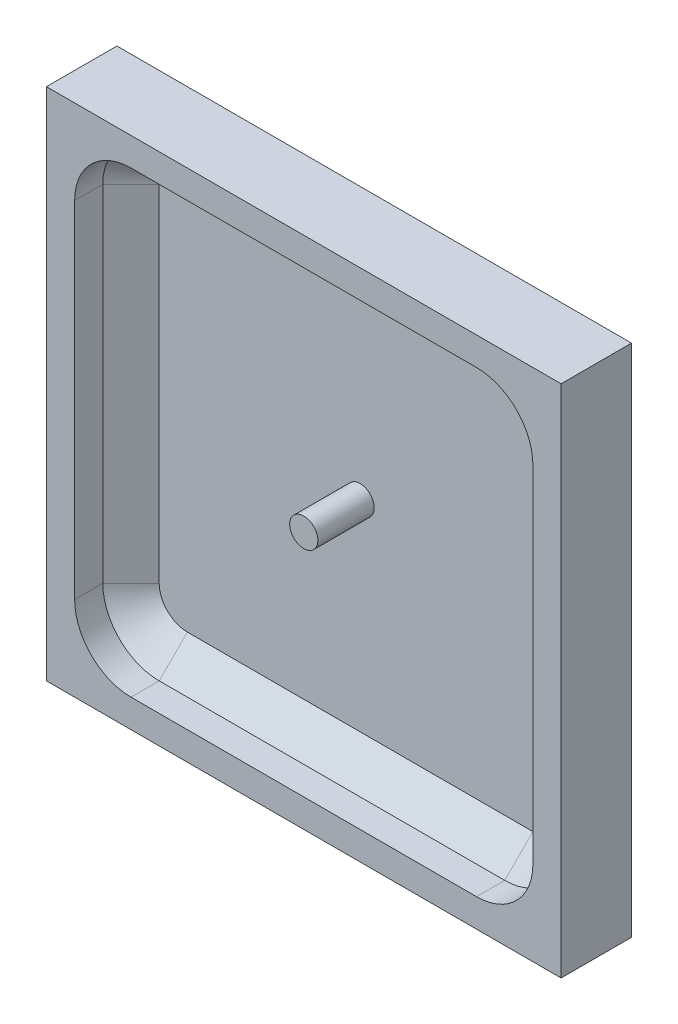
ISO-10303-21;
HEADER;
FILE_DESCRIPTION(('STEP AP214'),'2;1');
FILE_NAME('part.step','',(''),(''),'','','');
FILE_SCHEMA(('AUTOMOTIVE_DESIGN { 1 0 10303 214 1 1 1 1 }'));
ENDSEC;
DATA;
#1=APPLICATION_CONTEXT('core data for automotive mechanical design processes');
#2=APPLICATION_PROTOCOL_DEFINITION('international standard','automotive_design',2000,#1);
#3=PRODUCT_CONTEXT('',#1,'mechanical');
#4=PRODUCT('Part','Part','',(#3));
#5=PRODUCT_RELATED_PRODUCT_CATEGORY('part','',(#4));
#6=PRODUCT_DEFINITION_FORMATION('','',#4);
#7=PRODUCT_DEFINITION_CONTEXT('part definition',#1,'design');
#8=PRODUCT_DEFINITION('design','',#6,#7);
#9=PRODUCT_DEFINITION_SHAPE('','',#8);
#10=(LENGTH_UNIT() NAMED_UNIT(*) SI_UNIT(.MILLI.,.METRE.));
#11=(NAMED_UNIT(*) PLANE_ANGLE_UNIT() SI_UNIT($,.RADIAN.));
#12=(NAMED_UNIT(*) SI_UNIT($,.STERADIAN.) SOLID_ANGLE_UNIT());
#13=UNCERTAINTY_MEASURE_WITH_UNIT(LENGTH_MEASURE(1.E-05),#10,'distance_accuracy_value','');
#14=(GEOMETRIC_REPRESENTATION_CONTEXT(3) GLOBAL_UNCERTAINTY_ASSIGNED_CONTEXT((#13)) GLOBAL_UNIT_ASSIGNED_CONTEXT((#10,
#11,#12)) REPRESENTATION_CONTEXT('',''));
#15=CARTESIAN_POINT('',(0.,0.,0.));
#16=DIRECTION('',(0.,0.,1.));
#17=DIRECTION('',(1.,0.,0.));
#18=AXIS2_PLACEMENT_3D('',#15,#16,#17);
#19=CARTESIAN_POINT('',(-18.2634559672906,-18.2634559672906,-5.));
#20=DIRECTION('',(-1.,0.,0.));
#21=DIRECTION('',(0.,0.,1.));
#22=AXIS2_PLACEMENT_3D('',#19,#20,#21);
#23=PLANE('',#22);
#24=DIRECTION('',(0.,-1.,0.));
#25=VECTOR('',#24,1.);
#26=CARTESIAN_POINT('',(-18.2634559672906,-18.2634559672906,0.));
#27=LINE('',#26,#25);
#28=CARTESIAN_POINT('',(-18.2634559672906,18.2634559672906,0.));
#29=VERTEX_POINT('',#28);
#30=CARTESIAN_POINT('',(-18.2634559672906,-18.2634559672906,0.));
#31=VERTEX_POINT('',#30);
#32=EDGE_CURVE('E238',#29,#31,#27,.T.);
#33=ORIENTED_EDGE('',*,*,#32,.F.);
#34=DIRECTION('',(0.,0.,1.));
#35=VECTOR('',#34,1.);
#36=CARTESIAN_POINT('',(-18.2634559672906,18.2634559672906,-5.));
#37=LINE('',#36,#35);
#38=CARTESIAN_POINT('',(-18.2634559672906,18.2634559672906,-5.));
#39=VERTEX_POINT('',#38);
#40=EDGE_CURVE('E11',#39,#29,#37,.T.);
#41=ORIENTED_EDGE('',*,*,#40,.F.);
#42=DIRECTION('',(0.,-1.,0.));
#43=VECTOR('',#42,1.);
#44=CARTESIAN_POINT('',(-18.2634559672906,-18.2634559672906,-5.));
#45=LINE('',#44,#43);
#46=CARTESIAN_POINT('',(-18.2634559672906,-18.2634559672906,-5.));
#47=VERTEX_POINT('',#46);
#48=EDGE_CURVE('E262',#39,#47,#45,.T.);
#49=ORIENTED_EDGE('',*,*,#48,.T.);
#50=DIRECTION('',(0.,0.,1.));
#51=VECTOR('',#50,1.);
#52=CARTESIAN_POINT('',(-18.2634559672906,-18.2634559672906,-5.));
#53=LINE('',#52,#51);
#54=EDGE_CURVE('E42',#47,#31,#53,.T.);
#55=ORIENTED_EDGE('',*,*,#54,.T.);
#56=EDGE_LOOP('',(#33,#41,#49,#55));
#57=FACE_BOUND('',#56,.T.);
#58=ADVANCED_FACE('F39',(#57),#23,.T.);
#59=CARTESIAN_POINT('',(18.2634559672906,18.2634559672906,-5.));
#60=DIRECTION('',(0.,1.,0.));
#61=DIRECTION('',(0.,0.,1.));
#62=AXIS2_PLACEMENT_3D('',#59,#60,#61);
#63=PLANE('',#62);
#64=DIRECTION('',(-1.,0.,0.));
#65=VECTOR('',#64,1.);
#66=CARTESIAN_POINT('',(18.2634559672906,18.2634559672906,0.));
#67=LINE('',#66,#65);
#68=CARTESIAN_POINT('',(18.2634559672906,18.2634559672906,0.));
#69=VERTEX_POINT('',#68);
#70=EDGE_CURVE('E265',#69,#29,#67,.T.);
#71=ORIENTED_EDGE('',*,*,#70,.F.);
#72=DIRECTION('',(0.,0.,1.));
#73=VECTOR('',#72,1.);
#74=CARTESIAN_POINT('',(18.2634559672906,18.2634559672906,-5.));
#75=LINE('',#74,#73);
#76=CARTESIAN_POINT('',(18.2634559672906,18.2634559672906,-5.));
#77=VERTEX_POINT('',#76);
#78=EDGE_CURVE('E47',#77,#69,#75,.T.);
#79=ORIENTED_EDGE('',*,*,#78,.F.);
#80=DIRECTION('',(-1.,0.,0.));
#81=VECTOR('',#80,1.);
#82=CARTESIAN_POINT('',(18.2634559672906,18.2634559672906,-5.));
#83=LINE('',#82,#81);
#84=EDGE_CURVE('E270',#77,#39,#83,.T.);
#85=ORIENTED_EDGE('',*,*,#84,.T.);
#86=ORIENTED_EDGE('',*,*,#40,.T.);
#87=EDGE_LOOP('',(#71,#79,#85,#86));
#88=FACE_BOUND('',#87,.T.);
#89=ADVANCED_FACE('F285',(#88),#63,.T.);
#90=CARTESIAN_POINT('',(18.2634559672906,-18.2634559672906,-5.));
#91=DIRECTION('',(1.,0.,0.));
#92=DIRECTION('',(0.,0.,-1.));
#93=AXIS2_PLACEMENT_3D('',#90,#91,#92);
#94=PLANE('',#93);
#95=DIRECTION('',(0.,1.,0.));
#96=VECTOR('',#95,1.);
#97=CARTESIAN_POINT('',(18.2634559672906,-18.2634559672906,0.));
#98=LINE('',#97,#96);
#99=CARTESIAN_POINT('',(18.2634559672906,-18.2634559672906,0.));
#100=VERTEX_POINT('',#99);
#101=EDGE_CURVE('E277',#100,#69,#98,.T.);
#102=ORIENTED_EDGE('',*,*,#101,.F.);
#103=DIRECTION('',(0.,0.,1.));
#104=VECTOR('',#103,1.);
#105=CARTESIAN_POINT('',(18.2634559672906,-18.2634559672906,-5.));
#106=LINE('',#105,#104);
#107=CARTESIAN_POINT('',(18.2634559672906,-18.2634559672906,-5.));
#108=VERTEX_POINT('',#107);
#109=EDGE_CURVE('E282',#108,#100,#106,.T.);
#110=ORIENTED_EDGE('',*,*,#109,.F.);
#111=DIRECTION('',(0.,1.,0.));
#112=VECTOR('',#111,1.);
#113=CARTESIAN_POINT('',(18.2634559672906,-18.2634559672906,-5.));
#114=LINE('',#113,#112);
#115=EDGE_CURVE('E267',#108,#77,#114,.T.);
#116=ORIENTED_EDGE('',*,*,#115,.T.);
#117=ORIENTED_EDGE('',*,*,#78,.T.);
#118=EDGE_LOOP('',(#102,#110,#116,#117));
#119=FACE_BOUND('',#118,.T.);
#120=ADVANCED_FACE('F289',(#119),#94,.T.);
#121=CARTESIAN_POINT('',(18.2634559672906,-18.2634559672906,-5.));
#122=DIRECTION('',(0.,-1.,0.));
#123=DIRECTION('',(0.,0.,-1.));
#124=AXIS2_PLACEMENT_3D('',#121,#122,#123);
#125=PLANE('',#124);
#126=DIRECTION('',(1.,0.,0.));
#127=VECTOR('',#126,1.);
#128=CARTESIAN_POINT('',(18.2634559672906,-18.2634559672906,0.));
#129=LINE('',#128,#127);
#130=EDGE_CURVE('E274',#31,#100,#129,.T.);
#131=ORIENTED_EDGE('',*,*,#130,.F.);
#132=ORIENTED_EDGE('',*,*,#54,.F.);
#133=DIRECTION('',(1.,0.,0.));
#134=VECTOR('',#133,1.);
#135=CARTESIAN_POINT('',(18.2634559672906,-18.2634559672906,-5.));
#136=LINE('',#135,#134);
#137=EDGE_CURVE('E264',#47,#108,#136,.T.);
#138=ORIENTED_EDGE('',*,*,#137,.T.);
#139=ORIENTED_EDGE('',*,*,#109,.T.);
#140=EDGE_LOOP('',(#131,#132,#138,#139));
#141=FACE_BOUND('',#140,.T.);
#142=ADVANCED_FACE('F284',(#141),#125,.T.);
#143=CARTESIAN_POINT('',(0.,0.,-5.));
#144=DIRECTION('',(0.,0.,1.));
#145=DIRECTION('',(1.,0.,0.));
#146=AXIS2_PLACEMENT_3D('',#143,#144,#145);
#147=PLANE('',#146);
#148=ORIENTED_EDGE('',*,*,#48,.F.);
#149=ORIENTED_EDGE('',*,*,#84,.F.);
#150=ORIENTED_EDGE('',*,*,#115,.F.);
#151=ORIENTED_EDGE('',*,*,#137,.F.);
#152=EDGE_LOOP('',(#148,#149,#150,#151));
#153=FACE_BOUND('',#152,.T.);
#154=ADVANCED_FACE('F291',(#153),#147,.F.);
#155=CARTESIAN_POINT('',(0.,0.,0.));
#156=DIRECTION('',(0.,0.,1.));
#157=DIRECTION('',(1.,0.,0.));
#158=AXIS2_PLACEMENT_3D('',#155,#156,#157);
#159=PLANE('',#158);
#160=CARTESIAN_POINT('',(-12.2634559672906,-12.2634559672906,0.));
#161=DIRECTION('',(0.,0.,-1.));
#162=DIRECTION('',(-1.,0.,0.));
#163=AXIS2_PLACEMENT_3D('',#160,#161,#162);
#164=CIRCLE('',#163,4.);
#165=CARTESIAN_POINT('',(-16.2634559672906,-12.2634559672906,0.));
#166=VERTEX_POINT('',#165);
#167=CARTESIAN_POINT('',(-12.2634559672906,-16.2634559672906,0.));
#168=VERTEX_POINT('',#167);
#169=EDGE_CURVE('E187',#166,#168,#164,.F.);
#170=ORIENTED_EDGE('',*,*,#169,.F.);
#171=DIRECTION('',(0.,1.,0.));
#172=VECTOR('',#171,1.);
#173=CARTESIAN_POINT('',(-16.2634559672906,-16.2634559672906,0.));
#174=LINE('',#173,#172);
#175=CARTESIAN_POINT('',(-16.2634559672906,12.2634559672906,0.));
#176=VERTEX_POINT('',#175);
#177=EDGE_CURVE('E181',#166,#176,#174,.T.);
#178=ORIENTED_EDGE('',*,*,#177,.T.);
#179=CARTESIAN_POINT('',(-12.2634559672906,12.2634559672906,0.));
#180=DIRECTION('',(0.,0.,-1.));
#181=DIRECTION('',(-1.,0.,0.));
#182=AXIS2_PLACEMENT_3D('',#179,#180,#181);
#183=CIRCLE('',#182,4.);
#184=CARTESIAN_POINT('',(-12.2634559672906,16.2634559672906,0.));
#185=VERTEX_POINT('',#184);
#186=EDGE_CURVE('E191',#185,#176,#183,.F.);
#187=ORIENTED_EDGE('',*,*,#186,.F.);
#188=DIRECTION('',(1.,0.,0.));
#189=VECTOR('',#188,1.);
#190=CARTESIAN_POINT('',(-16.2634559672906,16.2634559672906,0.));
#191=LINE('',#190,#189);
#192=CARTESIAN_POINT('',(12.2634559672906,16.2634559672906,0.));
#193=VERTEX_POINT('',#192);
#194=EDGE_CURVE('E522',#185,#193,#191,.T.);
#195=ORIENTED_EDGE('',*,*,#194,.T.);
#196=CARTESIAN_POINT('',(12.2634559672906,12.2634559672906,0.));
#197=DIRECTION('',(0.,0.,-1.));
#198=DIRECTION('',(-1.,0.,0.));
#199=AXIS2_PLACEMENT_3D('',#196,#197,#198);
#200=CIRCLE('',#199,4.);
#201=CARTESIAN_POINT('',(16.2634559672906,12.2634559672906,0.));
#202=VERTEX_POINT('',#201);
#203=EDGE_CURVE('E171',#202,#193,#200,.F.);
#204=ORIENTED_EDGE('',*,*,#203,.F.);
#205=DIRECTION('',(0.,-1.,0.));
#206=VECTOR('',#205,1.);
#207=CARTESIAN_POINT('',(16.2634559672906,-16.2634559672906,0.));
#208=LINE('',#207,#206);
#209=CARTESIAN_POINT('',(16.2634559672906,-12.2634559672906,0.));
#210=VERTEX_POINT('',#209);
#211=EDGE_CURVE('E55',#202,#210,#208,.T.);
#212=ORIENTED_EDGE('',*,*,#211,.T.);
#213=CARTESIAN_POINT('',(12.2634559672906,-12.2634559672906,0.));
#214=DIRECTION('',(0.,0.,-1.));
#215=DIRECTION('',(-1.,0.,0.));
#216=AXIS2_PLACEMENT_3D('',#213,#214,#215);
#217=CIRCLE('',#216,4.);
#218=CARTESIAN_POINT('',(12.2634559672906,-16.2634559672906,0.));
#219=VERTEX_POINT('',#218);
#220=EDGE_CURVE('E166',#219,#210,#217,.F.);
#221=ORIENTED_EDGE('',*,*,#220,.F.);
#222=DIRECTION('',(-1.,0.,0.));
#223=VECTOR('',#222,1.);
#224=CARTESIAN_POINT('',(-16.2634559672906,-16.2634559672906,0.));
#225=LINE('',#224,#223);
#226=EDGE_CURVE('E176',#219,#168,#225,.T.);
#227=ORIENTED_EDGE('',*,*,#226,.T.);
#228=EDGE_LOOP('',(#170,#178,#187,#195,#204,#212,#221,#227));
#229=FACE_BOUND('',#228,.T.);
#230=ORIENTED_EDGE('',*,*,#32,.T.);
#231=ORIENTED_EDGE('',*,*,#130,.T.);
#232=ORIENTED_EDGE('',*,*,#101,.T.);
#233=ORIENTED_EDGE('',*,*,#70,.T.);
#234=EDGE_LOOP('',(#230,#231,#232,#233));
#235=FACE_BOUND('',#234,.T.);
#236=ADVANCED_FACE('F183',(#229,#235),#159,.T.);
#237=CARTESIAN_POINT('',(16.2634559672906,-16.2634559672906,-4.));
#238=DIRECTION('',(-1.,0.,0.));
#239=DIRECTION('',(0.,0.,1.));
#240=AXIS2_PLACEMENT_3D('',#237,#238,#239);
#241=PLANE('',#240);
#242=DIRECTION('',(0.,0.,1.));
#243=VECTOR('',#242,1.);
#244=CARTESIAN_POINT('',(16.2634559672906,-12.2634559672906,-4.));
#245=LINE('',#244,#243);
#246=CARTESIAN_POINT('',(16.2634559672906,-12.2634559672906,-2.));
#247=VERTEX_POINT('',#246);
#248=EDGE_CURVE('E189',#210,#247,#245,.F.);
#249=ORIENTED_EDGE('',*,*,#248,.F.);
#250=ORIENTED_EDGE('',*,*,#211,.F.);
#251=DIRECTION('',(0.,0.,1.));
#252=VECTOR('',#251,1.);
#253=CARTESIAN_POINT('',(16.2634559672906,12.2634559672906,-4.));
#254=LINE('',#253,#252);
#255=CARTESIAN_POINT('',(16.2634559672906,12.2634559672906,-2.));
#256=VERTEX_POINT('',#255);
#257=EDGE_CURVE('E186',#256,#202,#254,.T.);
#258=ORIENTED_EDGE('',*,*,#257,.F.);
#259=DIRECTION('',(0.,1.,0.));
#260=VECTOR('',#259,1.);
#261=CARTESIAN_POINT('',(16.2634559672906,12.2634559672906,-2.));
#262=LINE('',#261,#260);
#263=EDGE_CURVE('E230',#247,#256,#262,.T.);
#264=ORIENTED_EDGE('',*,*,#263,.F.);
#265=EDGE_LOOP('',(#249,#250,#258,#264));
#266=FACE_BOUND('',#265,.T.);
#267=ADVANCED_FACE('F298',(#266),#241,.T.);
#268=CARTESIAN_POINT('',(-16.2634559672906,-16.2634559672906,-4.));
#269=DIRECTION('',(0.,1.,0.));
#270=DIRECTION('',(1.,0.,0.));
#271=AXIS2_PLACEMENT_3D('',#268,#269,#270);
#272=PLANE('',#271);
#273=DIRECTION('',(0.,0.,1.));
#274=VECTOR('',#273,1.);
#275=CARTESIAN_POINT('',(-12.2634559672906,-16.2634559672906,-4.));
#276=LINE('',#275,#274);
#277=CARTESIAN_POINT('',(-12.2634559672906,-16.2634559672906,-2.));
#278=VERTEX_POINT('',#277);
#279=EDGE_CURVE('E172',#168,#278,#276,.F.);
#280=ORIENTED_EDGE('',*,*,#279,.F.);
#281=ORIENTED_EDGE('',*,*,#226,.F.);
#282=DIRECTION('',(0.,0.,1.));
#283=VECTOR('',#282,1.);
#284=CARTESIAN_POINT('',(12.2634559672906,-16.2634559672906,-4.));
#285=LINE('',#284,#283);
#286=CARTESIAN_POINT('',(12.2634559672906,-16.2634559672906,-2.));
#287=VERTEX_POINT('',#286);
#288=EDGE_CURVE('E161',#287,#219,#285,.T.);
#289=ORIENTED_EDGE('',*,*,#288,.F.);
#290=DIRECTION('',(1.,0.,0.));
#291=VECTOR('',#290,1.);
#292=CARTESIAN_POINT('',(12.2634559672906,-16.2634559672906,-2.));
#293=LINE('',#292,#291);
#294=EDGE_CURVE('E223',#278,#287,#293,.T.);
#295=ORIENTED_EDGE('',*,*,#294,.F.);
#296=EDGE_LOOP('',(#280,#281,#289,#295));
#297=FACE_BOUND('',#296,.T.);
#298=ADVANCED_FACE('F177',(#297),#272,.T.);
#299=CARTESIAN_POINT('',(-16.2634559672906,-16.2634559672906,-4.));
#300=DIRECTION('',(1.,0.,0.));
#301=DIRECTION('',(0.,0.,-1.));
#302=AXIS2_PLACEMENT_3D('',#299,#300,#301);
#303=PLANE('',#302);
#304=DIRECTION('',(0.,0.,1.));
#305=VECTOR('',#304,1.);
#306=CARTESIAN_POINT('',(-16.2634559672906,12.2634559672906,-4.));
#307=LINE('',#306,#305);
#308=CARTESIAN_POINT('',(-16.2634559672906,12.2634559672906,-2.));
#309=VERTEX_POINT('',#308);
#310=EDGE_CURVE('E196',#176,#309,#307,.F.);
#311=ORIENTED_EDGE('',*,*,#310,.F.);
#312=ORIENTED_EDGE('',*,*,#177,.F.);
#313=DIRECTION('',(0.,0.,1.));
#314=VECTOR('',#313,1.);
#315=CARTESIAN_POINT('',(-16.2634559672906,-12.2634559672906,-4.));
#316=LINE('',#315,#314);
#317=CARTESIAN_POINT('',(-16.2634559672906,-12.2634559672906,-2.));
#318=VERTEX_POINT('',#317);
#319=EDGE_CURVE('E199',#318,#166,#316,.T.);
#320=ORIENTED_EDGE('',*,*,#319,.F.);
#321=DIRECTION('',(0.,-1.,0.));
#322=VECTOR('',#321,1.);
#323=CARTESIAN_POINT('',(-16.2634559672906,-12.2634559672906,-2.));
#324=LINE('',#323,#322);
#325=EDGE_CURVE('E228',#309,#318,#324,.T.);
#326=ORIENTED_EDGE('',*,*,#325,.F.);
#327=EDGE_LOOP('',(#311,#312,#320,#326));
#328=FACE_BOUND('',#327,.T.);
#329=ADVANCED_FACE('F345',(#328),#303,.T.);
#330=CARTESIAN_POINT('',(-16.2634559672906,16.2634559672906,-4.));
#331=DIRECTION('',(0.,-1.,0.));
#332=DIRECTION('',(-1.,0.,0.));
#333=AXIS2_PLACEMENT_3D('',#330,#331,#332);
#334=PLANE('',#333);
#335=DIRECTION('',(0.,0.,1.));
#336=VECTOR('',#335,1.);
#337=CARTESIAN_POINT('',(12.2634559672906,16.2634559672906,-4.));
#338=LINE('',#337,#336);
#339=CARTESIAN_POINT('',(12.2634559672906,16.2634559672906,-2.));
#340=VERTEX_POINT('',#339);
#341=EDGE_CURVE('E201',#193,#340,#338,.F.);
#342=ORIENTED_EDGE('',*,*,#341,.F.);
#343=ORIENTED_EDGE('',*,*,#194,.F.);
#344=DIRECTION('',(0.,0.,1.));
#345=VECTOR('',#344,1.);
#346=CARTESIAN_POINT('',(-12.2634559672906,16.2634559672906,-4.));
#347=LINE('',#346,#345);
#348=CARTESIAN_POINT('',(-12.2634559672906,16.2634559672906,-2.));
#349=VERTEX_POINT('',#348);
#350=EDGE_CURVE('E204',#349,#185,#347,.T.);
#351=ORIENTED_EDGE('',*,*,#350,.F.);
#352=DIRECTION('',(-1.,0.,0.));
#353=VECTOR('',#352,1.);
#354=CARTESIAN_POINT('',(-12.2634559672906,16.2634559672906,-2.));
#355=LINE('',#354,#353);
#356=EDGE_CURVE('E236',#340,#349,#355,.T.);
#357=ORIENTED_EDGE('',*,*,#356,.F.);
#358=EDGE_LOOP('',(#342,#343,#351,#357));
#359=FACE_BOUND('',#358,.T.);
#360=ADVANCED_FACE('F354',(#359),#334,.T.);
#361=CARTESIAN_POINT('',(0.,0.,-4.));
#362=DIRECTION('',(0.,0.,-1.));
#363=DIRECTION('',(-1.,0.,0.));
#364=AXIS2_PLACEMENT_3D('',#361,#362,#363);
#365=PLANE('',#364);
#366=CARTESIAN_POINT('',(0.,0.,-4.));
#367=DIRECTION('',(0.,0.,-1.));
#368=DIRECTION('',(-1.,0.,0.));
#369=AXIS2_PLACEMENT_3D('',#366,#367,#368);
#370=CIRCLE('',#369,1.);
#371=CARTESIAN_POINT('',(-1.,0.,-4.));
#372=VERTEX_POINT('',#371);
#373=EDGE_CURVE('E514',#372,#372,#370,.T.);
#374=ORIENTED_EDGE('',*,*,#373,.T.);
#375=EDGE_LOOP('',(#374));
#376=FACE_BOUND('',#375,.T.);
#377=CARTESIAN_POINT('',(12.2634559672906,-12.2634559672906,-4.));
#378=DIRECTION('',(0.,0.,-1.));
#379=DIRECTION('',(-1.,0.,0.));
#380=AXIS2_PLACEMENT_3D('',#377,#378,#379);
#381=CIRCLE('',#380,2.00000000000001);
#382=CARTESIAN_POINT('',(14.2634559672906,-12.2634559672906,-4.));
#383=VERTEX_POINT('',#382);
#384=CARTESIAN_POINT('',(12.2634559672906,-14.2634559672906,-4.));
#385=VERTEX_POINT('',#384);
#386=EDGE_CURVE('E216',#383,#385,#381,.T.);
#387=ORIENTED_EDGE('',*,*,#386,.F.);
#388=DIRECTION('',(0.,-1.,0.));
#389=VECTOR('',#388,1.);
#390=CARTESIAN_POINT('',(14.2634559672906,-12.2634559672906,-4.));
#391=LINE('',#390,#389);
#392=CARTESIAN_POINT('',(14.2634559672906,12.2634559672906,-4.));
#393=VERTEX_POINT('',#392);
#394=EDGE_CURVE('E212',#393,#383,#391,.T.);
#395=ORIENTED_EDGE('',*,*,#394,.F.);
#396=CARTESIAN_POINT('',(12.2634559672906,12.2634559672906,-4.));
#397=DIRECTION('',(0.,0.,-1.));
#398=DIRECTION('',(-1.,0.,0.));
#399=AXIS2_PLACEMENT_3D('',#396,#397,#398);
#400=CIRCLE('',#399,2.00000000000001);
#401=CARTESIAN_POINT('',(12.2634559672906,14.2634559672906,-4.));
#402=VERTEX_POINT('',#401);
#403=EDGE_CURVE('E208',#402,#393,#400,.T.);
#404=ORIENTED_EDGE('',*,*,#403,.F.);
#405=DIRECTION('',(1.,0.,0.));
#406=VECTOR('',#405,1.);
#407=CARTESIAN_POINT('',(12.2634559672906,14.2634559672906,-4.));
#408=LINE('',#407,#406);
#409=CARTESIAN_POINT('',(-12.2634559672906,14.2634559672906,-4.));
#410=VERTEX_POINT('',#409);
#411=EDGE_CURVE('E206',#410,#402,#408,.T.);
#412=ORIENTED_EDGE('',*,*,#411,.F.);
#413=CARTESIAN_POINT('',(-12.2634559672906,12.2634559672906,-4.));
#414=DIRECTION('',(0.,0.,-1.));
#415=DIRECTION('',(-1.,0.,0.));
#416=AXIS2_PLACEMENT_3D('',#413,#414,#415);
#417=CIRCLE('',#416,2.00000000000001);
#418=CARTESIAN_POINT('',(-14.2634559672906,12.2634559672906,-4.));
#419=VERTEX_POINT('',#418);
#420=EDGE_CURVE('E210',#419,#410,#417,.T.);
#421=ORIENTED_EDGE('',*,*,#420,.F.);
#422=DIRECTION('',(0.,1.,0.));
#423=VECTOR('',#422,1.);
#424=CARTESIAN_POINT('',(-14.2634559672906,12.2634559672906,-4.));
#425=LINE('',#424,#423);
#426=CARTESIAN_POINT('',(-14.2634559672906,-12.2634559672906,-4.));
#427=VERTEX_POINT('',#426);
#428=EDGE_CURVE('E214',#427,#419,#425,.T.);
#429=ORIENTED_EDGE('',*,*,#428,.F.);
#430=CARTESIAN_POINT('',(-12.2634559672906,-12.2634559672906,-4.));
#431=DIRECTION('',(0.,0.,-1.));
#432=DIRECTION('',(-1.,0.,0.));
#433=AXIS2_PLACEMENT_3D('',#430,#431,#432);
#434=CIRCLE('',#433,2.00000000000001);
#435=CARTESIAN_POINT('',(-12.2634559672906,-14.2634559672906,-4.));
#436=VERTEX_POINT('',#435);
#437=EDGE_CURVE('E218',#436,#427,#434,.T.);
#438=ORIENTED_EDGE('',*,*,#437,.F.);
#439=DIRECTION('',(-1.,0.,0.));
#440=VECTOR('',#439,1.);
#441=CARTESIAN_POINT('',(-12.2634559672906,-14.2634559672906,-4.));
#442=LINE('',#441,#440);
#443=EDGE_CURVE('E220',#385,#436,#442,.T.);
#444=ORIENTED_EDGE('',*,*,#443,.F.);
#445=EDGE_LOOP('',(#387,#395,#404,#412,#421,#429,#438,#444));
#446=FACE_BOUND('',#445,.T.);
#447=ADVANCED_FACE('F364',(#376,#446),#365,.F.);
#448=CARTESIAN_POINT('',(12.2634559672906,-12.2634559672906,-4.));
#449=DIRECTION('',(0.,0.,1.));
#450=DIRECTION('',(1.,0.,0.));
#451=AXIS2_PLACEMENT_3D('',#448,#449,#450);
#452=CYLINDRICAL_SURFACE('',#451,4.);
#453=ORIENTED_EDGE('',*,*,#288,.T.);
#454=ORIENTED_EDGE('',*,*,#220,.T.);
#455=ORIENTED_EDGE('',*,*,#248,.T.);
#456=CARTESIAN_POINT('',(12.2634559672906,-12.2634559672906,-2.));
#457=DIRECTION('',(0.,0.,-1.));
#458=DIRECTION('',(-1.,0.,0.));
#459=AXIS2_PLACEMENT_3D('',#456,#457,#458);
#460=CIRCLE('',#459,4.);
#461=EDGE_CURVE('E167',#287,#247,#460,.F.);
#462=ORIENTED_EDGE('',*,*,#461,.F.);
#463=EDGE_LOOP('',(#453,#454,#455,#462));
#464=FACE_BOUND('',#463,.T.);
#465=ADVANCED_FACE('F163',(#464),#452,.F.);
#466=CARTESIAN_POINT('',(-12.2634559672906,-12.2634559672906,-4.));
#467=DIRECTION('',(0.,0.,1.));
#468=DIRECTION('',(1.,0.,0.));
#469=AXIS2_PLACEMENT_3D('',#466,#467,#468);
#470=CYLINDRICAL_SURFACE('',#469,4.);
#471=ORIENTED_EDGE('',*,*,#319,.T.);
#472=ORIENTED_EDGE('',*,*,#169,.T.);
#473=ORIENTED_EDGE('',*,*,#279,.T.);
#474=CARTESIAN_POINT('',(-12.2634559672906,-12.2634559672906,-2.));
#475=DIRECTION('',(0.,0.,-1.));
#476=DIRECTION('',(-1.,0.,0.));
#477=AXIS2_PLACEMENT_3D('',#474,#475,#476);
#478=CIRCLE('',#477,4.);
#479=EDGE_CURVE('E225',#318,#278,#478,.F.);
#480=ORIENTED_EDGE('',*,*,#479,.F.);
#481=EDGE_LOOP('',(#471,#472,#473,#480));
#482=FACE_BOUND('',#481,.T.);
#483=ADVANCED_FACE('F383',(#482),#470,.F.);
#484=CARTESIAN_POINT('',(-12.2634559672906,12.2634559672906,-4.));
#485=DIRECTION('',(0.,0.,1.));
#486=DIRECTION('',(1.,0.,0.));
#487=AXIS2_PLACEMENT_3D('',#484,#485,#486);
#488=CYLINDRICAL_SURFACE('',#487,4.);
#489=ORIENTED_EDGE('',*,*,#350,.T.);
#490=ORIENTED_EDGE('',*,*,#186,.T.);
#491=ORIENTED_EDGE('',*,*,#310,.T.);
#492=CARTESIAN_POINT('',(-12.2634559672906,12.2634559672906,-2.));
#493=DIRECTION('',(0.,0.,-1.));
#494=DIRECTION('',(-1.,0.,0.));
#495=AXIS2_PLACEMENT_3D('',#492,#493,#494);
#496=CIRCLE('',#495,4.);
#497=EDGE_CURVE('E232',#349,#309,#496,.F.);
#498=ORIENTED_EDGE('',*,*,#497,.F.);
#499=EDGE_LOOP('',(#489,#490,#491,#498));
#500=FACE_BOUND('',#499,.T.);
#501=ADVANCED_FACE('F392',(#500),#488,.F.);
#502=CARTESIAN_POINT('',(12.2634559672906,12.2634559672906,-4.));
#503=DIRECTION('',(0.,0.,1.));
#504=DIRECTION('',(1.,0.,0.));
#505=AXIS2_PLACEMENT_3D('',#502,#503,#504);
#506=CYLINDRICAL_SURFACE('',#505,4.);
#507=ORIENTED_EDGE('',*,*,#257,.T.);
#508=ORIENTED_EDGE('',*,*,#203,.T.);
#509=ORIENTED_EDGE('',*,*,#341,.T.);
#510=CARTESIAN_POINT('',(12.2634559672906,12.2634559672906,-2.));
#511=DIRECTION('',(0.,0.,-1.));
#512=DIRECTION('',(-1.,0.,0.));
#513=AXIS2_PLACEMENT_3D('',#510,#511,#512);
#514=CIRCLE('',#513,4.);
#515=EDGE_CURVE('E234',#256,#340,#514,.F.);
#516=ORIENTED_EDGE('',*,*,#515,.F.);
#517=EDGE_LOOP('',(#507,#508,#509,#516));
#518=FACE_BOUND('',#517,.T.);
#519=ADVANCED_FACE('F402',(#518),#506,.F.);
#520=CARTESIAN_POINT('',(0.,14.2634559672906,-4.));
#521=DIRECTION('',(0.,0.70710678118655,-0.707106781186545));
#522=DIRECTION('',(-1.,0.,0.));
#523=AXIS2_PLACEMENT_3D('',#520,#521,#522);
#524=PLANE('',#523);
#525=DIRECTION('',(0.,-0.707106781186545,-0.70710678118655));
#526=VECTOR('',#525,1.);
#527=CARTESIAN_POINT('',(-12.2634559672906,16.2634559672906,-2.));
#528=LINE('',#527,#526);
#529=EDGE_CURVE('E256',#349,#410,#528,.T.);
#530=ORIENTED_EDGE('',*,*,#529,.T.);
#531=ORIENTED_EDGE('',*,*,#411,.T.);
#532=DIRECTION('',(0.,0.707106781186545,0.70710678118655));
#533=VECTOR('',#532,1.);
#534=CARTESIAN_POINT('',(12.2634559672906,14.2634559672906,-4.));
#535=LINE('',#534,#533);
#536=EDGE_CURVE('E259',#402,#340,#535,.T.);
#537=ORIENTED_EDGE('',*,*,#536,.T.);
#538=ORIENTED_EDGE('',*,*,#356,.T.);
#539=EDGE_LOOP('',(#530,#531,#537,#538));
#540=FACE_BOUND('',#539,.T.);
#541=ADVANCED_FACE('F412',(#540),#524,.F.);
#542=CARTESIAN_POINT('',(12.2634559672906,12.2634559672906,-4.));
#543=DIRECTION('',(0.,0.,1.));
#544=DIRECTION('',(1.,0.,0.));
#545=AXIS2_PLACEMENT_3D('',#542,#543,#544);
#546=CONICAL_SURFACE('',#545,2.00000000000001,0.785398163397445);
#547=ORIENTED_EDGE('',*,*,#536,.F.);
#548=ORIENTED_EDGE('',*,*,#403,.T.);
#549=DIRECTION('',(0.707106781186545,0.,0.70710678118655));
#550=VECTOR('',#549,1.);
#551=CARTESIAN_POINT('',(14.2634559672906,12.2634559672906,-4.));
#552=LINE('',#551,#550);
#553=EDGE_CURVE('E253',#393,#256,#552,.T.);
#554=ORIENTED_EDGE('',*,*,#553,.T.);
#555=ORIENTED_EDGE('',*,*,#515,.T.);
#556=EDGE_LOOP('',(#547,#548,#554,#555));
#557=FACE_BOUND('',#556,.T.);
#558=ADVANCED_FACE('F422',(#557),#546,.F.);
#559=CARTESIAN_POINT('',(-12.2634559672906,12.2634559672906,-4.));
#560=DIRECTION('',(0.,0.,1.));
#561=DIRECTION('',(1.,0.,0.));
#562=AXIS2_PLACEMENT_3D('',#559,#560,#561);
#563=CONICAL_SURFACE('',#562,2.00000000000001,0.785398163397445);
#564=ORIENTED_EDGE('',*,*,#529,.F.);
#565=ORIENTED_EDGE('',*,*,#497,.T.);
#566=DIRECTION('',(0.707106781186545,0.,-0.70710678118655));
#567=VECTOR('',#566,1.);
#568=CARTESIAN_POINT('',(-16.2634559672906,12.2634559672906,-2.));
#569=LINE('',#568,#567);
#570=EDGE_CURVE('E250',#309,#419,#569,.T.);
#571=ORIENTED_EDGE('',*,*,#570,.T.);
#572=ORIENTED_EDGE('',*,*,#420,.T.);
#573=EDGE_LOOP('',(#564,#565,#571,#572));
#574=FACE_BOUND('',#573,.T.);
#575=ADVANCED_FACE('F431',(#574),#563,.F.);
#576=CARTESIAN_POINT('',(14.2634559672906,0.,-4.));
#577=DIRECTION('',(0.70710678118655,0.,-0.707106781186545));
#578=DIRECTION('',(0.,1.,0.));
#579=AXIS2_PLACEMENT_3D('',#576,#577,#578);
#580=PLANE('',#579);
#581=ORIENTED_EDGE('',*,*,#553,.F.);
#582=ORIENTED_EDGE('',*,*,#394,.T.);
#583=DIRECTION('',(0.707106781186545,0.,0.70710678118655));
#584=VECTOR('',#583,1.);
#585=CARTESIAN_POINT('',(14.2634559672906,-12.2634559672906,-4.));
#586=LINE('',#585,#584);
#587=EDGE_CURVE('E247',#383,#247,#586,.T.);
#588=ORIENTED_EDGE('',*,*,#587,.T.);
#589=ORIENTED_EDGE('',*,*,#263,.T.);
#590=EDGE_LOOP('',(#581,#582,#588,#589));
#591=FACE_BOUND('',#590,.T.);
#592=ADVANCED_FACE('F441',(#591),#580,.F.);
#593=CARTESIAN_POINT('',(-14.2634559672906,0.,-4.));
#594=DIRECTION('',(-0.70710678118655,0.,-0.707106781186545));
#595=DIRECTION('',(0.,-1.,0.));
#596=AXIS2_PLACEMENT_3D('',#593,#594,#595);
#597=PLANE('',#596);
#598=ORIENTED_EDGE('',*,*,#570,.F.);
#599=ORIENTED_EDGE('',*,*,#325,.T.);
#600=DIRECTION('',(0.707106781186545,0.,-0.70710678118655));
#601=VECTOR('',#600,1.);
#602=CARTESIAN_POINT('',(-16.2634559672906,-12.2634559672906,-2.));
#603=LINE('',#602,#601);
#604=EDGE_CURVE('E244',#318,#427,#603,.T.);
#605=ORIENTED_EDGE('',*,*,#604,.T.);
#606=ORIENTED_EDGE('',*,*,#428,.T.);
#607=EDGE_LOOP('',(#598,#599,#605,#606));
#608=FACE_BOUND('',#607,.T.);
#609=ADVANCED_FACE('F451',(#608),#597,.F.);
#610=CARTESIAN_POINT('',(12.2634559672906,-12.2634559672906,-4.));
#611=DIRECTION('',(0.,0.,1.));
#612=DIRECTION('',(1.,0.,0.));
#613=AXIS2_PLACEMENT_3D('',#610,#611,#612);
#614=CONICAL_SURFACE('',#613,2.00000000000001,0.785398163397445);
#615=ORIENTED_EDGE('',*,*,#587,.F.);
#616=ORIENTED_EDGE('',*,*,#386,.T.);
#617=DIRECTION('',(0.,-0.707106781186545,0.70710678118655));
#618=VECTOR('',#617,1.);
#619=CARTESIAN_POINT('',(12.2634559672906,-14.2634559672906,-4.));
#620=LINE('',#619,#618);
#621=EDGE_CURVE('E241',#385,#287,#620,.T.);
#622=ORIENTED_EDGE('',*,*,#621,.T.);
#623=ORIENTED_EDGE('',*,*,#461,.T.);
#624=EDGE_LOOP('',(#615,#616,#622,#623));
#625=FACE_BOUND('',#624,.T.);
#626=ADVANCED_FACE('F461',(#625),#614,.F.);
#627=CARTESIAN_POINT('',(-12.2634559672906,-12.2634559672906,-4.));
#628=DIRECTION('',(0.,0.,1.));
#629=DIRECTION('',(1.,0.,0.));
#630=AXIS2_PLACEMENT_3D('',#627,#628,#629);
#631=CONICAL_SURFACE('',#630,2.00000000000001,0.785398163397445);
#632=ORIENTED_EDGE('',*,*,#604,.F.);
#633=ORIENTED_EDGE('',*,*,#479,.T.);
#634=DIRECTION('',(0.,0.707106781186545,-0.70710678118655));
#635=VECTOR('',#634,1.);
#636=CARTESIAN_POINT('',(-12.2634559672906,-16.2634559672906,-2.));
#637=LINE('',#636,#635);
#638=EDGE_CURVE('E239',#278,#436,#637,.T.);
#639=ORIENTED_EDGE('',*,*,#638,.T.);
#640=ORIENTED_EDGE('',*,*,#437,.T.);
#641=EDGE_LOOP('',(#632,#633,#639,#640));
#642=FACE_BOUND('',#641,.T.);
#643=ADVANCED_FACE('F471',(#642),#631,.F.);
#644=CARTESIAN_POINT('',(0.,-14.2634559672906,-4.));
#645=DIRECTION('',(0.,-0.70710678118655,-0.707106781186545));
#646=DIRECTION('',(1.,0.,0.));
#647=AXIS2_PLACEMENT_3D('',#644,#645,#646);
#648=PLANE('',#647);
#649=ORIENTED_EDGE('',*,*,#621,.F.);
#650=ORIENTED_EDGE('',*,*,#443,.T.);
#651=ORIENTED_EDGE('',*,*,#638,.F.);
#652=ORIENTED_EDGE('',*,*,#294,.T.);
#653=EDGE_LOOP('',(#649,#650,#651,#652));
#654=FACE_BOUND('',#653,.T.);
#655=ADVANCED_FACE('F481',(#654),#648,.F.);
#656=CARTESIAN_POINT('',(0.,0.,0.));
#657=DIRECTION('',(0.,0.,-1.));
#658=DIRECTION('',(-1.,0.,0.));
#659=AXIS2_PLACEMENT_3D('',#656,#657,#658);
#660=CYLINDRICAL_SURFACE('',#659,1.);
#661=CARTESIAN_POINT('',(0.,0.,0.));
#662=DIRECTION('',(0.,0.,-1.));
#663=DIRECTION('',(-1.,0.,0.));
#664=AXIS2_PLACEMENT_3D('',#661,#662,#663);
#665=CIRCLE('',#664,1.);
#666=CARTESIAN_POINT('',(-1.,0.,0.));
#667=VERTEX_POINT('',#666);
#668=EDGE_CURVE('E242',#667,#667,#665,.T.);
#669=ORIENTED_EDGE('',*,*,#668,.T.);
#670=EDGE_LOOP('',(#669));
#671=FACE_BOUND('',#670,.T.);
#672=ORIENTED_EDGE('',*,*,#373,.F.);
#673=EDGE_LOOP('',(#672));
#674=FACE_BOUND('',#673,.T.);
#675=ADVANCED_FACE('F491',(#671,#674),#660,.T.);
#676=ORIENTED_EDGE('',*,*,#668,.F.);
#677=EDGE_LOOP('',(#676));
#678=FACE_BOUND('',#677,.T.);
#679=ADVANCED_FACE('F300',(#678),#159,.T.);
#680=CLOSED_SHELL('',(#58,#89,#120,#142,#154,#236,#267,#298,#329,#360,#447,#465,#483,#501,#519,
#541,#558,#575,#592,#609,#626,#643,#655,#675,#679));
#681=MANIFOLD_SOLID_BREP('B2',#680);
#682=ADVANCED_BREP_SHAPE_REPRESENTATION('',(#18,#681),#14);
#683=SHAPE_DEFINITION_REPRESENTATION(#9,#682);
ENDSEC;
END-ISO-10303-21;
